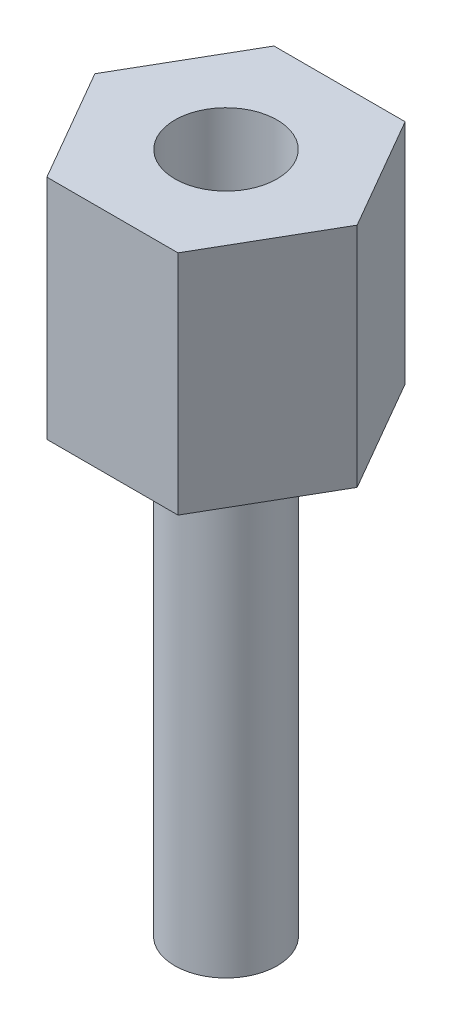
ISO-10303-21;
HEADER;
FILE_DESCRIPTION(('STEP AP214'),'2;1');
FILE_NAME('part.step','',(''),(''),'','','');
FILE_SCHEMA(('AUTOMOTIVE_DESIGN { 1 0 10303 214 1 1 1 1 }'));
ENDSEC;
DATA;
#1=APPLICATION_CONTEXT('core data for automotive mechanical design processes');
#2=APPLICATION_PROTOCOL_DEFINITION('international standard','automotive_design',2000,#1);
#3=PRODUCT_CONTEXT('',#1,'mechanical');
#4=PRODUCT('Part','Part','',(#3));
#5=PRODUCT_RELATED_PRODUCT_CATEGORY('part','',(#4));
#6=PRODUCT_DEFINITION_FORMATION('','',#4);
#7=PRODUCT_DEFINITION_CONTEXT('part definition',#1,'design');
#8=PRODUCT_DEFINITION('design','',#6,#7);
#9=PRODUCT_DEFINITION_SHAPE('','',#8);
#10=(LENGTH_UNIT() NAMED_UNIT(*) SI_UNIT(.MILLI.,.METRE.));
#11=(NAMED_UNIT(*) PLANE_ANGLE_UNIT() SI_UNIT($,.RADIAN.));
#12=(NAMED_UNIT(*) SI_UNIT($,.STERADIAN.) SOLID_ANGLE_UNIT());
#13=UNCERTAINTY_MEASURE_WITH_UNIT(LENGTH_MEASURE(1.E-05),#10,'distance_accuracy_value','');
#14=(GEOMETRIC_REPRESENTATION_CONTEXT(3) GLOBAL_UNCERTAINTY_ASSIGNED_CONTEXT((#13)) GLOBAL_UNIT_ASSIGNED_CONTEXT((#10,
#11,#12)) REPRESENTATION_CONTEXT('',''));
#15=CARTESIAN_POINT('',(0.,0.,0.));
#16=DIRECTION('',(0.,0.,1.));
#17=DIRECTION('',(1.,0.,0.));
#18=AXIS2_PLACEMENT_3D('',#15,#16,#17);
#19=CARTESIAN_POINT('',(1.73205080756888,6.,3.));
#20=DIRECTION('',(-0.866025403784439,0.,-0.5));
#21=DIRECTION('',(-0.5,0.,0.866025403784439));
#22=AXIS2_PLACEMENT_3D('',#19,#20,#21);
#23=PLANE('',#22);
#24=DIRECTION('',(0.5,0.,-0.866025403784439));
#25=VECTOR('',#24,1.);
#26=CARTESIAN_POINT('',(1.73205080756888,0.,3.));
#27=LINE('',#26,#25);
#28=CARTESIAN_POINT('',(1.73205080756888,0.,3.));
#29=VERTEX_POINT('',#28);
#30=CARTESIAN_POINT('',(3.46410161513776,0.,0.));
#31=VERTEX_POINT('',#30);
#32=EDGE_CURVE('E117',#29,#31,#27,.T.);
#33=ORIENTED_EDGE('',*,*,#32,.T.);
#34=DIRECTION('',(0.,-1.,0.));
#35=VECTOR('',#34,1.);
#36=CARTESIAN_POINT('',(3.46410161513776,6.,0.));
#37=LINE('',#36,#35);
#38=CARTESIAN_POINT('',(3.46410161513776,6.,0.));
#39=VERTEX_POINT('',#38);
#40=EDGE_CURVE('E40',#39,#31,#37,.T.);
#41=ORIENTED_EDGE('',*,*,#40,.F.);
#42=DIRECTION('',(0.5,0.,-0.866025403784439));
#43=VECTOR('',#42,1.);
#44=CARTESIAN_POINT('',(1.73205080756888,6.,3.));
#45=LINE('',#44,#43);
#46=CARTESIAN_POINT('',(1.73205080756888,6.,3.));
#47=VERTEX_POINT('',#46);
#48=EDGE_CURVE('E128',#47,#39,#45,.T.);
#49=ORIENTED_EDGE('',*,*,#48,.F.);
#50=DIRECTION('',(0.,-1.,0.));
#51=VECTOR('',#50,1.);
#52=CARTESIAN_POINT('',(1.73205080756888,6.,3.));
#53=LINE('',#52,#51);
#54=EDGE_CURVE('E113',#47,#29,#53,.T.);
#55=ORIENTED_EDGE('',*,*,#54,.T.);
#56=EDGE_LOOP('',(#33,#41,#49,#55));
#57=FACE_BOUND('',#56,.T.);
#58=ADVANCED_FACE('F32',(#57),#23,.F.);
#59=CARTESIAN_POINT('',(3.46410161513776,6.,0.));
#60=DIRECTION('',(-0.866025403784438,0.,0.5));
#61=DIRECTION('',(0.5,0.,0.866025403784439));
#62=AXIS2_PLACEMENT_3D('',#59,#60,#61);
#63=PLANE('',#62);
#64=DIRECTION('',(-0.5,0.,-0.866025403784439));
#65=VECTOR('',#64,1.);
#66=CARTESIAN_POINT('',(3.46410161513776,0.,0.));
#67=LINE('',#66,#65);
#68=CARTESIAN_POINT('',(1.73205080756888,0.,-3.));
#69=VERTEX_POINT('',#68);
#70=EDGE_CURVE('E120',#31,#69,#67,.T.);
#71=ORIENTED_EDGE('',*,*,#70,.T.);
#72=DIRECTION('',(0.,-1.,0.));
#73=VECTOR('',#72,1.);
#74=CARTESIAN_POINT('',(1.73205080756888,6.,-3.));
#75=LINE('',#74,#73);
#76=CARTESIAN_POINT('',(1.73205080756888,6.,-3.));
#77=VERTEX_POINT('',#76);
#78=EDGE_CURVE('E132',#77,#69,#75,.T.);
#79=ORIENTED_EDGE('',*,*,#78,.F.);
#80=DIRECTION('',(-0.5,0.,-0.866025403784439));
#81=VECTOR('',#80,1.);
#82=CARTESIAN_POINT('',(3.46410161513776,6.,0.));
#83=LINE('',#82,#81);
#84=EDGE_CURVE('E86',#39,#77,#83,.T.);
#85=ORIENTED_EDGE('',*,*,#84,.F.);
#86=ORIENTED_EDGE('',*,*,#40,.T.);
#87=EDGE_LOOP('',(#71,#79,#85,#86));
#88=FACE_BOUND('',#87,.T.);
#89=ADVANCED_FACE('F135',(#88),#63,.F.);
#90=CARTESIAN_POINT('',(1.73205080756888,6.,-3.));
#91=DIRECTION('',(0.,0.,1.));
#92=DIRECTION('',(1.,0.,0.));
#93=AXIS2_PLACEMENT_3D('',#90,#91,#92);
#94=PLANE('',#93);
#95=DIRECTION('',(-1.,0.,0.));
#96=VECTOR('',#95,1.);
#97=CARTESIAN_POINT('',(1.73205080756888,0.,-3.));
#98=LINE('',#97,#96);
#99=CARTESIAN_POINT('',(-1.73205080756888,0.,-3.));
#100=VERTEX_POINT('',#99);
#101=EDGE_CURVE('E123',#69,#100,#98,.T.);
#102=ORIENTED_EDGE('',*,*,#101,.T.);
#103=DIRECTION('',(0.,-1.,0.));
#104=VECTOR('',#103,1.);
#105=CARTESIAN_POINT('',(-1.73205080756888,6.,-3.));
#106=LINE('',#105,#104);
#107=CARTESIAN_POINT('',(-1.73205080756888,6.,-3.));
#108=VERTEX_POINT('',#107);
#109=EDGE_CURVE('E108',#108,#100,#106,.T.);
#110=ORIENTED_EDGE('',*,*,#109,.F.);
#111=DIRECTION('',(-1.,0.,0.));
#112=VECTOR('',#111,1.);
#113=CARTESIAN_POINT('',(1.73205080756888,6.,-3.));
#114=LINE('',#113,#112);
#115=EDGE_CURVE('E99',#77,#108,#114,.T.);
#116=ORIENTED_EDGE('',*,*,#115,.F.);
#117=ORIENTED_EDGE('',*,*,#78,.T.);
#118=EDGE_LOOP('',(#102,#110,#116,#117));
#119=FACE_BOUND('',#118,.T.);
#120=ADVANCED_FACE('F143',(#119),#94,.F.);
#121=CARTESIAN_POINT('',(-1.73205080756888,6.,-3.));
#122=DIRECTION('',(0.866025403784439,0.,0.5));
#123=DIRECTION('',(0.5,0.,-0.866025403784439));
#124=AXIS2_PLACEMENT_3D('',#121,#122,#123);
#125=PLANE('',#124);
#126=DIRECTION('',(-0.5,0.,0.866025403784439));
#127=VECTOR('',#126,1.);
#128=CARTESIAN_POINT('',(-1.73205080756888,0.,-3.));
#129=LINE('',#128,#127);
#130=CARTESIAN_POINT('',(-3.46410161513776,0.,0.));
#131=VERTEX_POINT('',#130);
#132=EDGE_CURVE('E107',#100,#131,#129,.T.);
#133=ORIENTED_EDGE('',*,*,#132,.T.);
#134=DIRECTION('',(0.,-1.,0.));
#135=VECTOR('',#134,1.);
#136=CARTESIAN_POINT('',(-3.46410161513776,6.,0.));
#137=LINE('',#136,#135);
#138=CARTESIAN_POINT('',(-3.46410161513776,6.,0.));
#139=VERTEX_POINT('',#138);
#140=EDGE_CURVE('E104',#139,#131,#137,.T.);
#141=ORIENTED_EDGE('',*,*,#140,.F.);
#142=DIRECTION('',(-0.5,0.,0.866025403784439));
#143=VECTOR('',#142,1.);
#144=CARTESIAN_POINT('',(-1.73205080756888,6.,-3.));
#145=LINE('',#144,#143);
#146=EDGE_CURVE('E93',#108,#139,#145,.T.);
#147=ORIENTED_EDGE('',*,*,#146,.F.);
#148=ORIENTED_EDGE('',*,*,#109,.T.);
#149=EDGE_LOOP('',(#133,#141,#147,#148));
#150=FACE_BOUND('',#149,.T.);
#151=ADVANCED_FACE('F105',(#150),#125,.F.);
#152=CARTESIAN_POINT('',(-3.46410161513776,6.,0.));
#153=DIRECTION('',(0.866025403784439,0.,-0.5));
#154=DIRECTION('',(-0.5,0.,-0.866025403784439));
#155=AXIS2_PLACEMENT_3D('',#152,#153,#154);
#156=PLANE('',#155);
#157=DIRECTION('',(0.5,0.,0.866025403784438));
#158=VECTOR('',#157,1.);
#159=CARTESIAN_POINT('',(-3.46410161513776,0.,0.));
#160=LINE('',#159,#158);
#161=CARTESIAN_POINT('',(-1.73205080756888,0.,3.));
#162=VERTEX_POINT('',#161);
#163=EDGE_CURVE('E71',#131,#162,#160,.T.);
#164=ORIENTED_EDGE('',*,*,#163,.T.);
#165=DIRECTION('',(0.,-1.,0.));
#166=VECTOR('',#165,1.);
#167=CARTESIAN_POINT('',(-1.73205080756888,6.,3.));
#168=LINE('',#167,#166);
#169=CARTESIAN_POINT('',(-1.73205080756888,6.,3.));
#170=VERTEX_POINT('',#169);
#171=EDGE_CURVE('E109',#170,#162,#168,.T.);
#172=ORIENTED_EDGE('',*,*,#171,.F.);
#173=DIRECTION('',(0.5,0.,0.866025403784438));
#174=VECTOR('',#173,1.);
#175=CARTESIAN_POINT('',(-3.46410161513776,6.,0.));
#176=LINE('',#175,#174);
#177=EDGE_CURVE('E97',#139,#170,#176,.T.);
#178=ORIENTED_EDGE('',*,*,#177,.F.);
#179=ORIENTED_EDGE('',*,*,#140,.T.);
#180=EDGE_LOOP('',(#164,#172,#178,#179));
#181=FACE_BOUND('',#180,.T.);
#182=ADVANCED_FACE('F111',(#181),#156,.F.);
#183=CARTESIAN_POINT('',(-1.73205080756888,6.,3.));
#184=DIRECTION('',(0.,0.,-1.));
#185=DIRECTION('',(-1.,0.,0.));
#186=AXIS2_PLACEMENT_3D('',#183,#184,#185);
#187=PLANE('',#186);
#188=DIRECTION('',(1.,0.,0.));
#189=VECTOR('',#188,1.);
#190=CARTESIAN_POINT('',(-1.73205080756888,0.,3.));
#191=LINE('',#190,#189);
#192=EDGE_CURVE('E77',#162,#29,#191,.T.);
#193=ORIENTED_EDGE('',*,*,#192,.T.);
#194=ORIENTED_EDGE('',*,*,#54,.F.);
#195=DIRECTION('',(1.,0.,0.));
#196=VECTOR('',#195,1.);
#197=CARTESIAN_POINT('',(-1.73205080756888,6.,3.));
#198=LINE('',#197,#196);
#199=EDGE_CURVE('E48',#170,#47,#198,.T.);
#200=ORIENTED_EDGE('',*,*,#199,.F.);
#201=ORIENTED_EDGE('',*,*,#171,.T.);
#202=EDGE_LOOP('',(#193,#194,#200,#201));
#203=FACE_BOUND('',#202,.T.);
#204=ADVANCED_FACE('F166',(#203),#187,.F.);
#205=CARTESIAN_POINT('',(0.,6.,0.));
#206=DIRECTION('',(0.,1.,0.));
#207=DIRECTION('',(0.,0.,1.));
#208=AXIS2_PLACEMENT_3D('',#205,#206,#207);
#209=PLANE('',#208);
#210=CARTESIAN_POINT('',(0.,6.,0.));
#211=DIRECTION('',(0.,1.,0.));
#212=DIRECTION('',(0.,0.,1.));
#213=AXIS2_PLACEMENT_3D('',#210,#211,#212);
#214=CIRCLE('',#213,1.35);
#215=CARTESIAN_POINT('',(0.,6.,1.35));
#216=VERTEX_POINT('',#215);
#217=EDGE_CURVE('E150',#216,#216,#214,.T.);
#218=ORIENTED_EDGE('',*,*,#217,.F.);
#219=EDGE_LOOP('',(#218));
#220=FACE_BOUND('',#219,.T.);
#221=ORIENTED_EDGE('',*,*,#48,.T.);
#222=ORIENTED_EDGE('',*,*,#84,.T.);
#223=ORIENTED_EDGE('',*,*,#115,.T.);
#224=ORIENTED_EDGE('',*,*,#146,.T.);
#225=ORIENTED_EDGE('',*,*,#177,.T.);
#226=ORIENTED_EDGE('',*,*,#199,.T.);
#227=EDGE_LOOP('',(#221,#222,#223,#224,#225,#226));
#228=FACE_BOUND('',#227,.T.);
#229=ADVANCED_FACE('F95',(#220,#228),#209,.T.);
#230=CARTESIAN_POINT('',(0.,0.,0.));
#231=DIRECTION('',(0.,1.,0.));
#232=DIRECTION('',(0.,0.,1.));
#233=AXIS2_PLACEMENT_3D('',#230,#231,#232);
#234=PLANE('',#233);
#235=CARTESIAN_POINT('',(0.,0.,0.));
#236=DIRECTION('',(0.,1.,0.));
#237=DIRECTION('',(0.,0.,1.));
#238=AXIS2_PLACEMENT_3D('',#235,#236,#237);
#239=CIRCLE('',#238,1.3538379591145);
#240=CARTESIAN_POINT('',(0.,0.,1.3538379591145));
#241=VERTEX_POINT('',#240);
#242=EDGE_CURVE('E11',#241,#241,#239,.F.);
#243=ORIENTED_EDGE('',*,*,#242,.F.);
#244=EDGE_LOOP('',(#243));
#245=FACE_BOUND('',#244,.T.);
#246=ORIENTED_EDGE('',*,*,#32,.F.);
#247=ORIENTED_EDGE('',*,*,#192,.F.);
#248=ORIENTED_EDGE('',*,*,#163,.F.);
#249=ORIENTED_EDGE('',*,*,#132,.F.);
#250=ORIENTED_EDGE('',*,*,#101,.F.);
#251=ORIENTED_EDGE('',*,*,#70,.F.);
#252=EDGE_LOOP('',(#246,#247,#248,#249,#250,#251));
#253=FACE_BOUND('',#252,.T.);
#254=ADVANCED_FACE('F140',(#245,#253),#234,.F.);
#255=CARTESIAN_POINT('',(0.,-12.,0.));
#256=DIRECTION('',(0.,1.,0.));
#257=DIRECTION('',(0.,0.,1.));
#258=AXIS2_PLACEMENT_3D('',#255,#256,#257);
#259=CYLINDRICAL_SURFACE('',#258,1.3538379591145);
#260=CARTESIAN_POINT('',(0.,-12.,0.));
#261=DIRECTION('',(0.,-1.,0.));
#262=DIRECTION('',(0.,0.,-1.));
#263=AXIS2_PLACEMENT_3D('',#260,#261,#262);
#264=CIRCLE('',#263,1.3538379591145);
#265=CARTESIAN_POINT('',(0.,-12.,-1.3538379591145));
#266=VERTEX_POINT('',#265);
#267=EDGE_CURVE('E121',#266,#266,#264,.T.);
#268=ORIENTED_EDGE('',*,*,#267,.F.);
#269=EDGE_LOOP('',(#268));
#270=FACE_BOUND('',#269,.T.);
#271=ORIENTED_EDGE('',*,*,#242,.T.);
#272=EDGE_LOOP('',(#271));
#273=FACE_BOUND('',#272,.T.);
#274=ADVANCED_FACE('F173',(#270,#273),#259,.T.);
#275=CARTESIAN_POINT('',(0.,-12.,0.));
#276=DIRECTION('',(0.,-1.,0.));
#277=DIRECTION('',(0.,0.,-1.));
#278=AXIS2_PLACEMENT_3D('',#275,#276,#277);
#279=PLANE('',#278);
#280=ORIENTED_EDGE('',*,*,#267,.T.);
#281=EDGE_LOOP('',(#280));
#282=FACE_BOUND('',#281,.T.);
#283=ADVANCED_FACE('F161',(#282),#279,.T.);
#284=CARTESIAN_POINT('',(0.,1.,0.));
#285=DIRECTION('',(0.,1.,0.));
#286=DIRECTION('',(0.,0.,1.));
#287=AXIS2_PLACEMENT_3D('',#284,#285,#286);
#288=CYLINDRICAL_SURFACE('',#287,1.35);
#289=CARTESIAN_POINT('',(0.,1.,0.));
#290=DIRECTION('',(0.,1.,0.));
#291=DIRECTION('',(0.,0.,1.));
#292=AXIS2_PLACEMENT_3D('',#289,#290,#291);
#293=CIRCLE('',#292,1.35);
#294=CARTESIAN_POINT('',(0.,1.,1.35));
#295=VERTEX_POINT('',#294);
#296=EDGE_CURVE('E149',#295,#295,#293,.T.);
#297=ORIENTED_EDGE('',*,*,#296,.F.);
#298=EDGE_LOOP('',(#297));
#299=FACE_BOUND('',#298,.T.);
#300=ORIENTED_EDGE('',*,*,#217,.T.);
#301=EDGE_LOOP('',(#300));
#302=FACE_BOUND('',#301,.T.);
#303=ADVANCED_FACE('F158',(#299,#302),#288,.F.);
#304=CARTESIAN_POINT('',(0.,1.,0.));
#305=DIRECTION('',(0.,1.,0.));
#306=DIRECTION('',(0.,0.,1.));
#307=AXIS2_PLACEMENT_3D('',#304,#305,#306);
#308=PLANE('',#307);
#309=ORIENTED_EDGE('',*,*,#296,.T.);
#310=EDGE_LOOP('',(#309));
#311=FACE_BOUND('',#310,.T.);
#312=ADVANCED_FACE('F156',(#311),#308,.T.);
#313=CLOSED_SHELL('',(#58,#89,#120,#151,#182,#204,#229,#254,#274,#283,#303,#312));
#314=MANIFOLD_SOLID_BREP('B2',#313);
#315=ADVANCED_BREP_SHAPE_REPRESENTATION('',(#18,#314),#14);
#316=SHAPE_DEFINITION_REPRESENTATION(#9,#315);
ENDSEC;
END-ISO-10303-21;
